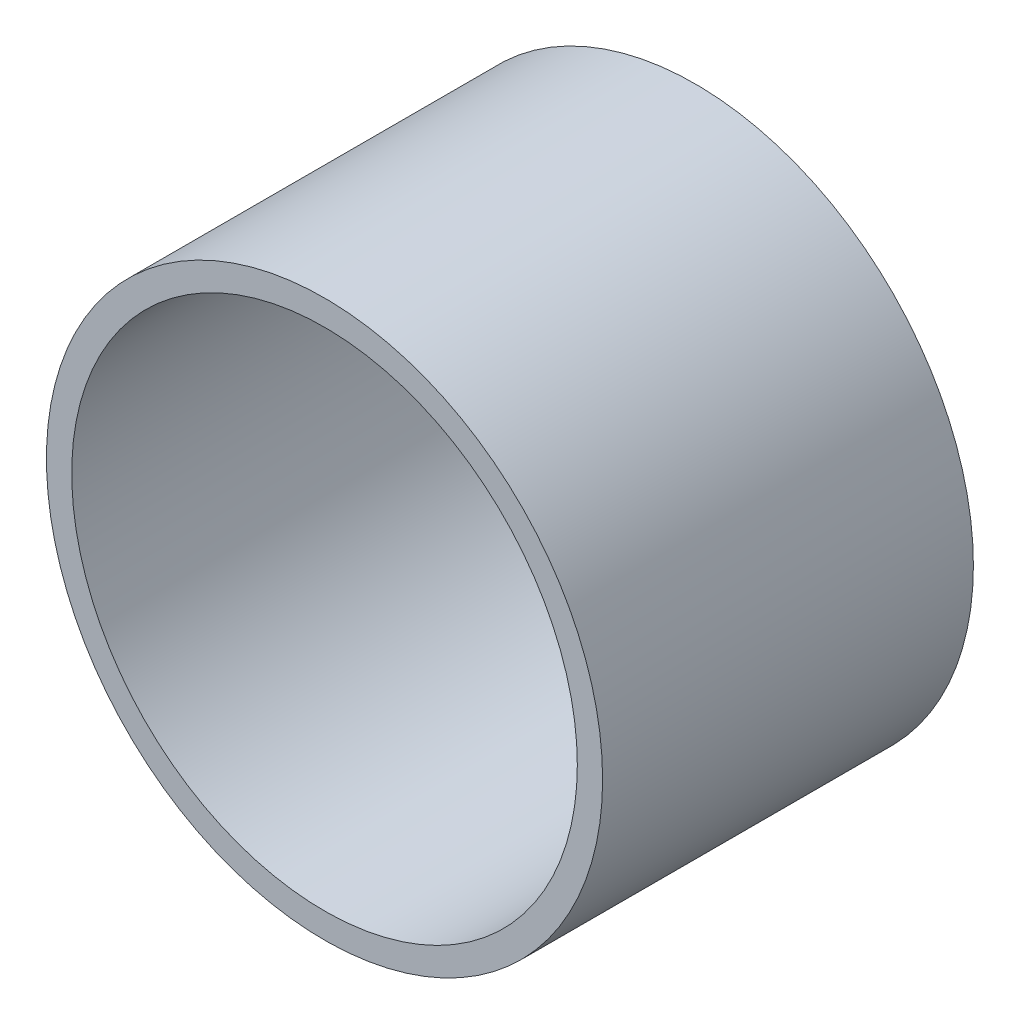
ISO-10303-21;
HEADER;
FILE_DESCRIPTION(('STEP AP214'),'2;1');
FILE_NAME('part.step','',(''),(''),'','','');
FILE_SCHEMA(('AUTOMOTIVE_DESIGN { 1 0 10303 214 1 1 1 1 }'));
ENDSEC;
DATA;
#1=APPLICATION_CONTEXT('core data for automotive mechanical design processes');
#2=APPLICATION_PROTOCOL_DEFINITION('international standard','automotive_design',2000,#1);
#3=PRODUCT_CONTEXT('',#1,'mechanical');
#4=PRODUCT('Part','Part','',(#3));
#5=PRODUCT_RELATED_PRODUCT_CATEGORY('part','',(#4));
#6=PRODUCT_DEFINITION_FORMATION('','',#4);
#7=PRODUCT_DEFINITION_CONTEXT('part definition',#1,'design');
#8=PRODUCT_DEFINITION('design','',#6,#7);
#9=PRODUCT_DEFINITION_SHAPE('','',#8);
#10=(LENGTH_UNIT() NAMED_UNIT(*) SI_UNIT(.MILLI.,.METRE.));
#11=(NAMED_UNIT(*) PLANE_ANGLE_UNIT() SI_UNIT($,.RADIAN.));
#12=(NAMED_UNIT(*) SI_UNIT($,.STERADIAN.) SOLID_ANGLE_UNIT());
#13=UNCERTAINTY_MEASURE_WITH_UNIT(LENGTH_MEASURE(1.E-05),#10,'distance_accuracy_value','');
#14=(GEOMETRIC_REPRESENTATION_CONTEXT(3) GLOBAL_UNCERTAINTY_ASSIGNED_CONTEXT((#13)) GLOBAL_UNIT_ASSIGNED_CONTEXT((#10,
#11,#12)) REPRESENTATION_CONTEXT('',''));
#15=CARTESIAN_POINT('',(0.,0.,0.));
#16=DIRECTION('',(0.,0.,1.));
#17=DIRECTION('',(1.,0.,0.));
#18=AXIS2_PLACEMENT_3D('',#15,#16,#17);
#19=CARTESIAN_POINT('',(0.,0.,22.));
#20=DIRECTION('',(0.,0.,1.));
#21=DIRECTION('',(1.,0.,0.));
#22=AXIS2_PLACEMENT_3D('',#19,#20,#21);
#23=PLANE('',#22);
#24=CARTESIAN_POINT('',(0.,0.,22.));
#25=DIRECTION('',(0.,0.,1.));
#26=DIRECTION('',(1.,0.,0.));
#27=AXIS2_PLACEMENT_3D('',#24,#25,#26);
#28=CIRCLE('',#27,16.5);
#29=CARTESIAN_POINT('',(16.5,0.,22.));
#30=VERTEX_POINT('',#29);
#31=EDGE_CURVE('E10',#30,#30,#28,.T.);
#32=ORIENTED_EDGE('',*,*,#31,.T.);
#33=EDGE_LOOP('',(#32));
#34=FACE_BOUND('',#33,.T.);
#35=CARTESIAN_POINT('',(0.,0.,22.));
#36=DIRECTION('',(0.,0.,1.));
#37=DIRECTION('',(1.,0.,0.));
#38=AXIS2_PLACEMENT_3D('',#35,#36,#37);
#39=CIRCLE('',#38,15.);
#40=CARTESIAN_POINT('',(15.,0.,22.));
#41=VERTEX_POINT('',#40);
#42=EDGE_CURVE('E48',#41,#41,#39,.T.);
#43=ORIENTED_EDGE('',*,*,#42,.F.);
#44=EDGE_LOOP('',(#43));
#45=FACE_BOUND('',#44,.T.);
#46=ADVANCED_FACE('F37',(#34,#45),#23,.T.);
#47=CARTESIAN_POINT('',(0.,0.,0.));
#48=DIRECTION('',(0.,0.,1.));
#49=DIRECTION('',(1.,0.,0.));
#50=AXIS2_PLACEMENT_3D('',#47,#48,#49);
#51=PLANE('',#50);
#52=CARTESIAN_POINT('',(0.,0.,0.));
#53=DIRECTION('',(0.,0.,1.));
#54=DIRECTION('',(1.,0.,0.));
#55=AXIS2_PLACEMENT_3D('',#52,#53,#54);
#56=CIRCLE('',#55,16.5);
#57=CARTESIAN_POINT('',(16.5,0.,0.));
#58=VERTEX_POINT('',#57);
#59=EDGE_CURVE('E41',#58,#58,#56,.T.);
#60=ORIENTED_EDGE('',*,*,#59,.F.);
#61=EDGE_LOOP('',(#60));
#62=FACE_BOUND('',#61,.T.);
#63=CARTESIAN_POINT('',(0.,0.,0.));
#64=DIRECTION('',(0.,0.,1.));
#65=DIRECTION('',(1.,0.,0.));
#66=AXIS2_PLACEMENT_3D('',#63,#64,#65);
#67=CIRCLE('',#66,15.);
#68=CARTESIAN_POINT('',(15.,0.,0.));
#69=VERTEX_POINT('',#68);
#70=EDGE_CURVE('E50',#69,#69,#67,.T.);
#71=ORIENTED_EDGE('',*,*,#70,.T.);
#72=EDGE_LOOP('',(#71));
#73=FACE_BOUND('',#72,.T.);
#74=ADVANCED_FACE('F60',(#62,#73),#51,.F.);
#75=CARTESIAN_POINT('',(0.,0.,22.));
#76=DIRECTION('',(0.,0.,-1.));
#77=DIRECTION('',(-1.,0.,0.));
#78=AXIS2_PLACEMENT_3D('',#75,#76,#77);
#79=CYLINDRICAL_SURFACE('',#78,16.5);
#80=ORIENTED_EDGE('',*,*,#31,.F.);
#81=EDGE_LOOP('',(#80));
#82=FACE_BOUND('',#81,.T.);
#83=ORIENTED_EDGE('',*,*,#59,.T.);
#84=EDGE_LOOP('',(#83));
#85=FACE_BOUND('',#84,.T.);
#86=ADVANCED_FACE('F39',(#82,#85),#79,.T.);
#87=CARTESIAN_POINT('',(0.,0.,22.));
#88=DIRECTION('',(0.,0.,-1.));
#89=DIRECTION('',(-1.,0.,0.));
#90=AXIS2_PLACEMENT_3D('',#87,#88,#89);
#91=CYLINDRICAL_SURFACE('',#90,15.);
#92=ORIENTED_EDGE('',*,*,#42,.T.);
#93=EDGE_LOOP('',(#92));
#94=FACE_BOUND('',#93,.T.);
#95=ORIENTED_EDGE('',*,*,#70,.F.);
#96=EDGE_LOOP('',(#95));
#97=FACE_BOUND('',#96,.T.);
#98=ADVANCED_FACE('F56',(#94,#97),#91,.F.);
#99=CLOSED_SHELL('',(#46,#74,#86,#98));
#100=MANIFOLD_SOLID_BREP('B2',#99);
#101=ADVANCED_BREP_SHAPE_REPRESENTATION('',(#18,#100),#14);
#102=SHAPE_DEFINITION_REPRESENTATION(#9,#101);
ENDSEC;
END-ISO-10303-21;
